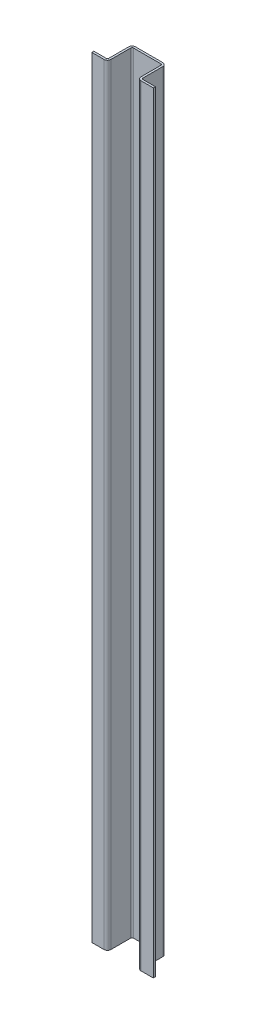
ISO-10303-21;
HEADER;
FILE_DESCRIPTION(('STEP AP214'),'2;1');
FILE_NAME('part.step','',(''),(''),'','','');
FILE_SCHEMA(('AUTOMOTIVE_DESIGN { 1 0 10303 214 1 1 1 1 }'));
ENDSEC;
DATA;
#1=APPLICATION_CONTEXT('core data for automotive mechanical design processes');
#2=APPLICATION_PROTOCOL_DEFINITION('international standard','automotive_design',2000,#1);
#3=PRODUCT_CONTEXT('',#1,'mechanical');
#4=PRODUCT('Part','Part','',(#3));
#5=PRODUCT_RELATED_PRODUCT_CATEGORY('part','',(#4));
#6=PRODUCT_DEFINITION_FORMATION('','',#4);
#7=PRODUCT_DEFINITION_CONTEXT('part definition',#1,'design');
#8=PRODUCT_DEFINITION('design','',#6,#7);
#9=PRODUCT_DEFINITION_SHAPE('','',#8);
#10=(LENGTH_UNIT() NAMED_UNIT(*) SI_UNIT(.MILLI.,.METRE.));
#11=(NAMED_UNIT(*) PLANE_ANGLE_UNIT() SI_UNIT($,.RADIAN.));
#12=(NAMED_UNIT(*) SI_UNIT($,.STERADIAN.) SOLID_ANGLE_UNIT());
#13=UNCERTAINTY_MEASURE_WITH_UNIT(LENGTH_MEASURE(1.E-05),#10,'distance_accuracy_value','');
#14=(GEOMETRIC_REPRESENTATION_CONTEXT(3) GLOBAL_UNCERTAINTY_ASSIGNED_CONTEXT((#13)) GLOBAL_UNIT_ASSIGNED_CONTEXT((#10,
#11,#12)) REPRESENTATION_CONTEXT('',''));
#15=CARTESIAN_POINT('',(0.,0.,0.));
#16=DIRECTION('',(0.,0.,1.));
#17=DIRECTION('',(1.,0.,0.));
#18=AXIS2_PLACEMENT_3D('',#15,#16,#17);
#19=CARTESIAN_POINT('',(-308.,-911.000000000001,-1.5));
#20=DIRECTION('',(1.,0.,0.));
#21=DIRECTION('',(0.,1.,0.));
#22=AXIS2_PLACEMENT_3D('',#19,#20,#21);
#23=PLANE('',#22);
#24=DIRECTION('',(0.,1.,0.));
#25=VECTOR('',#24,1.);
#26=CARTESIAN_POINT('',(-308.,-911.000000000001,-3.));
#27=LINE('',#26,#25);
#28=CARTESIAN_POINT('',(-308.,-347.000000000001,-3.));
#29=VERTEX_POINT('',#28);
#30=CARTESIAN_POINT('',(-308.,-911.000000000001,-3.));
#31=VERTEX_POINT('',#30);
#32=EDGE_CURVE('E176',#29,#31,#27,.F.);
#33=ORIENTED_EDGE('',*,*,#32,.T.);
#34=DIRECTION('',(0.,0.,1.));
#35=VECTOR('',#34,1.);
#36=CARTESIAN_POINT('',(-308.,-911.000000000001,-1.5));
#37=LINE('',#36,#35);
#38=CARTESIAN_POINT('',(-308.,-911.000000000001,-1.5));
#39=VERTEX_POINT('',#38);
#40=EDGE_CURVE('E137',#39,#31,#37,.F.);
#41=ORIENTED_EDGE('',*,*,#40,.F.);
#42=DIRECTION('',(0.,1.,0.));
#43=VECTOR('',#42,1.);
#44=CARTESIAN_POINT('',(-308.,-911.000000000001,-1.5));
#45=LINE('',#44,#43);
#46=CARTESIAN_POINT('',(-308.,-347.000000000001,-1.5));
#47=VERTEX_POINT('',#46);
#48=EDGE_CURVE('E179',#47,#39,#45,.F.);
#49=ORIENTED_EDGE('',*,*,#48,.F.);
#50=DIRECTION('',(0.,0.,1.));
#51=VECTOR('',#50,1.);
#52=CARTESIAN_POINT('',(-308.,-347.000000000002,-1.5));
#53=LINE('',#52,#51);
#54=EDGE_CURVE('E172',#29,#47,#53,.T.);
#55=ORIENTED_EDGE('',*,*,#54,.F.);
#56=EDGE_LOOP('',(#33,#41,#49,#55));
#57=FACE_BOUND('',#56,.T.);
#58=ADVANCED_FACE('F16',(#57),#23,.F.);
#59=CARTESIAN_POINT('',(-299.,-911.000000000001,-4.));
#60=DIRECTION('',(0.,1.,0.));
#61=DIRECTION('',(-1.,0.,0.));
#62=AXIS2_PLACEMENT_3D('',#59,#60,#61);
#63=CYLINDRICAL_SURFACE('',#62,1.);
#64=DIRECTION('',(0.,1.,0.));
#65=VECTOR('',#64,1.);
#66=CARTESIAN_POINT('',(-298.,-911.000000000001,-4.));
#67=LINE('',#66,#65);
#68=CARTESIAN_POINT('',(-298.,-347.000000000001,-4.));
#69=VERTEX_POINT('',#68);
#70=CARTESIAN_POINT('',(-298.,-911.000000000001,-4.));
#71=VERTEX_POINT('',#70);
#72=EDGE_CURVE('E283',#69,#71,#67,.F.);
#73=ORIENTED_EDGE('',*,*,#72,.T.);
#74=CARTESIAN_POINT('',(-299.,-911.000000000001,-4.));
#75=DIRECTION('',(0.,1.,0.));
#76=DIRECTION('',(-1.,0.,0.));
#77=AXIS2_PLACEMENT_3D('',#74,#75,#76);
#78=CIRCLE('',#77,1.);
#79=CARTESIAN_POINT('',(-299.,-911.000000000001,-3.));
#80=VERTEX_POINT('',#79);
#81=EDGE_CURVE('E19',#80,#71,#78,.T.);
#82=ORIENTED_EDGE('',*,*,#81,.F.);
#83=DIRECTION('',(0.,1.,0.));
#84=VECTOR('',#83,1.);
#85=CARTESIAN_POINT('',(-299.,-911.000000000001,-3.));
#86=LINE('',#85,#84);
#87=CARTESIAN_POINT('',(-299.,-347.000000000001,-3.));
#88=VERTEX_POINT('',#87);
#89=EDGE_CURVE('E187',#80,#88,#86,.T.);
#90=ORIENTED_EDGE('',*,*,#89,.T.);
#91=CARTESIAN_POINT('',(-299.,-347.000000000001,-4.));
#92=DIRECTION('',(0.,1.,0.));
#93=DIRECTION('',(-1.,0.,0.));
#94=AXIS2_PLACEMENT_3D('',#91,#92,#93);
#95=CIRCLE('',#94,1.);
#96=EDGE_CURVE('E191',#69,#88,#95,.F.);
#97=ORIENTED_EDGE('',*,*,#96,.F.);
#98=EDGE_LOOP('',(#73,#82,#90,#97));
#99=FACE_BOUND('',#98,.T.);
#100=ADVANCED_FACE('F338',(#99),#63,.F.);
#101=CARTESIAN_POINT('',(-272.,-911.000000000001,-4.));
#102=DIRECTION('',(0.,1.,0.));
#103=DIRECTION('',(-1.,0.,0.));
#104=AXIS2_PLACEMENT_3D('',#101,#102,#103);
#105=CYLINDRICAL_SURFACE('',#104,1.);
#106=DIRECTION('',(0.,1.,0.));
#107=VECTOR('',#106,1.);
#108=CARTESIAN_POINT('',(-272.,-911.000000000001,-3.));
#109=LINE('',#108,#107);
#110=CARTESIAN_POINT('',(-272.,-347.000000000001,-3.));
#111=VERTEX_POINT('',#110);
#112=CARTESIAN_POINT('',(-272.,-911.000000000001,-3.));
#113=VERTEX_POINT('',#112);
#114=EDGE_CURVE('E264',#111,#113,#109,.F.);
#115=ORIENTED_EDGE('',*,*,#114,.T.);
#116=CARTESIAN_POINT('',(-272.,-911.000000000001,-4.));
#117=DIRECTION('',(0.,1.,0.));
#118=DIRECTION('',(-1.,0.,0.));
#119=AXIS2_PLACEMENT_3D('',#116,#117,#118);
#120=CIRCLE('',#119,1.);
#121=CARTESIAN_POINT('',(-273.,-911.000000000001,-4.));
#122=VERTEX_POINT('',#121);
#123=EDGE_CURVE('E334',#122,#113,#120,.T.);
#124=ORIENTED_EDGE('',*,*,#123,.F.);
#125=DIRECTION('',(0.,-1.,0.));
#126=VECTOR('',#125,1.);
#127=CARTESIAN_POINT('',(-273.,-911.000000000001,-4.));
#128=LINE('',#127,#126);
#129=CARTESIAN_POINT('',(-273.,-347.000000000001,-4.));
#130=VERTEX_POINT('',#129);
#131=EDGE_CURVE('E267',#122,#130,#128,.F.);
#132=ORIENTED_EDGE('',*,*,#131,.T.);
#133=CARTESIAN_POINT('',(-272.,-347.000000000001,-4.));
#134=DIRECTION('',(0.,1.,0.));
#135=DIRECTION('',(-1.,0.,0.));
#136=AXIS2_PLACEMENT_3D('',#133,#134,#135);
#137=CIRCLE('',#136,1.);
#138=EDGE_CURVE('E302',#111,#130,#137,.F.);
#139=ORIENTED_EDGE('',*,*,#138,.F.);
#140=EDGE_LOOP('',(#115,#124,#132,#139));
#141=FACE_BOUND('',#140,.T.);
#142=ADVANCED_FACE('F364',(#141),#105,.F.);
#143=CARTESIAN_POINT('',(-263.,-911.000000000001,-3.));
#144=DIRECTION('',(-1.,0.,0.));
#145=DIRECTION('',(0.,-1.,0.));
#146=AXIS2_PLACEMENT_3D('',#143,#144,#145);
#147=PLANE('',#146);
#148=DIRECTION('',(0.,1.,0.));
#149=VECTOR('',#148,1.);
#150=CARTESIAN_POINT('',(-263.,-911.000000000001,-1.5));
#151=LINE('',#150,#149);
#152=CARTESIAN_POINT('',(-263.,-911.000000000001,-1.5));
#153=VERTEX_POINT('',#152);
#154=CARTESIAN_POINT('',(-263.,-347.000000000001,-1.5));
#155=VERTEX_POINT('',#154);
#156=EDGE_CURVE('E259',#153,#155,#151,.T.);
#157=ORIENTED_EDGE('',*,*,#156,.F.);
#158=DIRECTION('',(0.,0.,1.));
#159=VECTOR('',#158,1.);
#160=CARTESIAN_POINT('',(-263.,-911.000000000001,-3.));
#161=LINE('',#160,#159);
#162=CARTESIAN_POINT('',(-263.,-911.000000000001,-3.));
#163=VERTEX_POINT('',#162);
#164=EDGE_CURVE('E300',#163,#153,#161,.T.);
#165=ORIENTED_EDGE('',*,*,#164,.F.);
#166=DIRECTION('',(0.,1.,0.));
#167=VECTOR('',#166,1.);
#168=CARTESIAN_POINT('',(-263.,-911.000000000001,-3.));
#169=LINE('',#168,#167);
#170=CARTESIAN_POINT('',(-263.,-347.000000000001,-3.));
#171=VERTEX_POINT('',#170);
#172=EDGE_CURVE('E261',#163,#171,#169,.T.);
#173=ORIENTED_EDGE('',*,*,#172,.T.);
#174=DIRECTION('',(0.,0.,1.));
#175=VECTOR('',#174,1.);
#176=CARTESIAN_POINT('',(-263.,-347.000000000002,-3.));
#177=LINE('',#176,#175);
#178=EDGE_CURVE('E161',#155,#171,#177,.F.);
#179=ORIENTED_EDGE('',*,*,#178,.F.);
#180=EDGE_LOOP('',(#157,#165,#173,#179));
#181=FACE_BOUND('',#180,.T.);
#182=ADVANCED_FACE('F371',(#181),#147,.F.);
#183=CARTESIAN_POINT('',(-272.,-911.000000000001,-4.));
#184=DIRECTION('',(0.,1.,0.));
#185=DIRECTION('',(-1.,0.,0.));
#186=AXIS2_PLACEMENT_3D('',#183,#184,#185);
#187=CYLINDRICAL_SURFACE('',#186,2.5);
#188=CARTESIAN_POINT('',(-272.,-347.000000000001,-4.));
#189=DIRECTION('',(0.,1.,0.));
#190=DIRECTION('',(-1.,0.,0.));
#191=AXIS2_PLACEMENT_3D('',#188,#189,#190);
#192=CIRCLE('',#191,2.5);
#193=CARTESIAN_POINT('',(-272.,-347.000000000001,-1.5));
#194=VERTEX_POINT('',#193);
#195=CARTESIAN_POINT('',(-274.5,-347.000000000001,-4.));
#196=VERTEX_POINT('',#195);
#197=EDGE_CURVE('E209',#194,#196,#192,.F.);
#198=ORIENTED_EDGE('',*,*,#197,.T.);
#199=DIRECTION('',(0.,-1.,0.));
#200=VECTOR('',#199,1.);
#201=CARTESIAN_POINT('',(-274.5,-911.000000000001,-4.));
#202=LINE('',#201,#200);
#203=CARTESIAN_POINT('',(-274.5,-911.000000000001,-4.));
#204=VERTEX_POINT('',#203);
#205=EDGE_CURVE('E291',#204,#196,#202,.F.);
#206=ORIENTED_EDGE('',*,*,#205,.F.);
#207=CARTESIAN_POINT('',(-272.,-911.000000000001,-4.));
#208=DIRECTION('',(0.,1.,0.));
#209=DIRECTION('',(-1.,0.,0.));
#210=AXIS2_PLACEMENT_3D('',#207,#208,#209);
#211=CIRCLE('',#210,2.5);
#212=CARTESIAN_POINT('',(-272.,-911.000000000001,-1.5));
#213=VERTEX_POINT('',#212);
#214=EDGE_CURVE('E223',#213,#204,#211,.F.);
#215=ORIENTED_EDGE('',*,*,#214,.F.);
#216=DIRECTION('',(0.,1.,0.));
#217=VECTOR('',#216,1.);
#218=CARTESIAN_POINT('',(-272.,-911.000000000001,-1.5));
#219=LINE('',#218,#217);
#220=EDGE_CURVE('E257',#194,#213,#219,.F.);
#221=ORIENTED_EDGE('',*,*,#220,.F.);
#222=EDGE_LOOP('',(#198,#206,#215,#221));
#223=FACE_BOUND('',#222,.T.);
#224=ADVANCED_FACE('F380',(#223),#187,.T.);
#225=CARTESIAN_POINT('',(-274.5,-911.000000000001,-21.));
#226=DIRECTION('',(-1.,0.,0.));
#227=DIRECTION('',(0.,-1.,0.));
#228=AXIS2_PLACEMENT_3D('',#225,#226,#227);
#229=PLANE('',#228);
#230=DIRECTION('',(0.,0.,1.));
#231=VECTOR('',#230,1.);
#232=CARTESIAN_POINT('',(-274.5,-347.000000000001,-21.5));
#233=LINE('',#232,#231);
#234=CARTESIAN_POINT('',(-274.5,-347.000000000001,-18.5));
#235=VERTEX_POINT('',#234);
#236=EDGE_CURVE('E207',#196,#235,#233,.F.);
#237=ORIENTED_EDGE('',*,*,#236,.T.);
#238=DIRECTION('',(0.,1.,0.));
#239=VECTOR('',#238,1.);
#240=CARTESIAN_POINT('',(-274.5,-911.000000000001,-18.5));
#241=LINE('',#240,#239);
#242=CARTESIAN_POINT('',(-274.5,-911.000000000001,-18.5));
#243=VERTEX_POINT('',#242);
#244=EDGE_CURVE('E222',#235,#243,#241,.F.);
#245=ORIENTED_EDGE('',*,*,#244,.T.);
#246=DIRECTION('',(0.,0.,1.));
#247=VECTOR('',#246,1.);
#248=CARTESIAN_POINT('',(-274.5,-911.000000000001,-18.5));
#249=LINE('',#248,#247);
#250=EDGE_CURVE('E219',#204,#243,#249,.F.);
#251=ORIENTED_EDGE('',*,*,#250,.F.);
#252=ORIENTED_EDGE('',*,*,#205,.T.);
#253=EDGE_LOOP('',(#237,#245,#251,#252));
#254=FACE_BOUND('',#253,.T.);
#255=ADVANCED_FACE('F384',(#254),#229,.T.);
#256=CARTESIAN_POINT('',(-299.,-911.000000000001,-4.));
#257=DIRECTION('',(0.,1.,0.));
#258=DIRECTION('',(-1.,0.,0.));
#259=AXIS2_PLACEMENT_3D('',#256,#257,#258);
#260=CYLINDRICAL_SURFACE('',#259,2.5);
#261=CARTESIAN_POINT('',(-299.,-347.000000000001,-4.));
#262=DIRECTION('',(0.,1.,0.));
#263=DIRECTION('',(-1.,0.,0.));
#264=AXIS2_PLACEMENT_3D('',#261,#262,#263);
#265=CIRCLE('',#264,2.5);
#266=CARTESIAN_POINT('',(-296.5,-347.000000000001,-4.));
#267=VERTEX_POINT('',#266);
#268=CARTESIAN_POINT('',(-299.,-347.000000000001,-1.5));
#269=VERTEX_POINT('',#268);
#270=EDGE_CURVE('E197',#267,#269,#265,.F.);
#271=ORIENTED_EDGE('',*,*,#270,.T.);
#272=DIRECTION('',(0.,1.,0.));
#273=VECTOR('',#272,1.);
#274=CARTESIAN_POINT('',(-299.,-911.000000000001,-1.5));
#275=LINE('',#274,#273);
#276=CARTESIAN_POINT('',(-299.,-911.000000000001,-1.5));
#277=VERTEX_POINT('',#276);
#278=EDGE_CURVE('E288',#277,#269,#275,.T.);
#279=ORIENTED_EDGE('',*,*,#278,.F.);
#280=CARTESIAN_POINT('',(-299.,-911.000000000001,-4.));
#281=DIRECTION('',(0.,1.,0.));
#282=DIRECTION('',(-1.,0.,0.));
#283=AXIS2_PLACEMENT_3D('',#280,#281,#282);
#284=CIRCLE('',#283,2.5);
#285=CARTESIAN_POINT('',(-296.5,-911.000000000001,-4.));
#286=VERTEX_POINT('',#285);
#287=EDGE_CURVE('E250',#286,#277,#284,.F.);
#288=ORIENTED_EDGE('',*,*,#287,.F.);
#289=DIRECTION('',(0.,1.,0.));
#290=VECTOR('',#289,1.);
#291=CARTESIAN_POINT('',(-296.5,-911.000000000001,-4.));
#292=LINE('',#291,#290);
#293=EDGE_CURVE('E254',#267,#286,#292,.F.);
#294=ORIENTED_EDGE('',*,*,#293,.F.);
#295=EDGE_LOOP('',(#271,#279,#288,#294));
#296=FACE_BOUND('',#295,.T.);
#297=ADVANCED_FACE('F400',(#296),#260,.T.);
#298=CARTESIAN_POINT('',(-308.,-911.000000000001,-1.5));
#299=DIRECTION('',(0.,0.,1.));
#300=DIRECTION('',(1.,0.,0.));
#301=AXIS2_PLACEMENT_3D('',#298,#299,#300);
#302=PLANE('',#301);
#303=DIRECTION('',(1.,0.,0.));
#304=VECTOR('',#303,1.);
#305=CARTESIAN_POINT('',(-308.,-347.000000000001,-1.5));
#306=LINE('',#305,#304);
#307=EDGE_CURVE('E193',#269,#47,#306,.F.);
#308=ORIENTED_EDGE('',*,*,#307,.T.);
#309=ORIENTED_EDGE('',*,*,#48,.T.);
#310=DIRECTION('',(1.,0.,0.));
#311=VECTOR('',#310,1.);
#312=CARTESIAN_POINT('',(-274.5,-911.000000000001,-1.5));
#313=LINE('',#312,#311);
#314=EDGE_CURVE('E246',#277,#39,#313,.F.);
#315=ORIENTED_EDGE('',*,*,#314,.F.);
#316=ORIENTED_EDGE('',*,*,#278,.T.);
#317=EDGE_LOOP('',(#308,#309,#315,#316));
#318=FACE_BOUND('',#317,.T.);
#319=ADVANCED_FACE('F403',(#318),#302,.T.);
#320=CARTESIAN_POINT('',(-308.,-911.000000000001,-3.));
#321=DIRECTION('',(0.,0.,1.));
#322=DIRECTION('',(1.,0.,0.));
#323=AXIS2_PLACEMENT_3D('',#320,#321,#322);
#324=PLANE('',#323);
#325=ORIENTED_EDGE('',*,*,#89,.F.);
#326=DIRECTION('',(1.,0.,0.));
#327=VECTOR('',#326,1.);
#328=CARTESIAN_POINT('',(-274.5,-911.000000000001,-3.));
#329=LINE('',#328,#327);
#330=EDGE_CURVE('E186',#31,#80,#329,.T.);
#331=ORIENTED_EDGE('',*,*,#330,.F.);
#332=ORIENTED_EDGE('',*,*,#32,.F.);
#333=DIRECTION('',(1.,0.,0.));
#334=VECTOR('',#333,1.);
#335=CARTESIAN_POINT('',(-308.,-347.000000000001,-3.));
#336=LINE('',#335,#334);
#337=EDGE_CURVE('E185',#29,#88,#336,.T.);
#338=ORIENTED_EDGE('',*,*,#337,.T.);
#339=EDGE_LOOP('',(#325,#331,#332,#338));
#340=FACE_BOUND('',#339,.T.);
#341=ADVANCED_FACE('F184',(#340),#324,.F.);
#342=CARTESIAN_POINT('',(-298.,-911.000000000001,-3.));
#343=DIRECTION('',(1.,0.,0.));
#344=DIRECTION('',(0.,1.,0.));
#345=AXIS2_PLACEMENT_3D('',#342,#343,#344);
#346=PLANE('',#345);
#347=DIRECTION('',(0.,1.,0.));
#348=VECTOR('',#347,1.);
#349=CARTESIAN_POINT('',(-298.,-911.000000000001,-18.5));
#350=LINE('',#349,#348);
#351=CARTESIAN_POINT('',(-298.,-911.000000000001,-18.5));
#352=VERTEX_POINT('',#351);
#353=CARTESIAN_POINT('',(-298.,-347.000000000001,-18.5));
#354=VERTEX_POINT('',#353);
#355=EDGE_CURVE('E280',#352,#354,#350,.T.);
#356=ORIENTED_EDGE('',*,*,#355,.F.);
#357=DIRECTION('',(0.,0.,1.));
#358=VECTOR('',#357,1.);
#359=CARTESIAN_POINT('',(-298.,-911.000000000001,-18.5));
#360=LINE('',#359,#358);
#361=EDGE_CURVE('E242',#71,#352,#360,.F.);
#362=ORIENTED_EDGE('',*,*,#361,.F.);
#363=ORIENTED_EDGE('',*,*,#72,.F.);
#364=DIRECTION('',(0.,0.,1.));
#365=VECTOR('',#364,1.);
#366=CARTESIAN_POINT('',(-298.,-347.000000000001,-21.5));
#367=LINE('',#366,#365);
#368=EDGE_CURVE('E192',#69,#354,#367,.F.);
#369=ORIENTED_EDGE('',*,*,#368,.T.);
#370=EDGE_LOOP('',(#356,#362,#363,#369));
#371=FACE_BOUND('',#370,.T.);
#372=ADVANCED_FACE('F340',(#371),#346,.F.);
#373=CARTESIAN_POINT('',(-295.5,-911.000000000001,-18.5));
#374=DIRECTION('',(0.,1.,0.));
#375=DIRECTION('',(-1.,0.,0.));
#376=AXIS2_PLACEMENT_3D('',#373,#374,#375);
#377=CYLINDRICAL_SURFACE('',#376,2.5);
#378=ORIENTED_EDGE('',*,*,#355,.T.);
#379=CARTESIAN_POINT('',(-295.5,-347.000000000001,-18.5));
#380=DIRECTION('',(0.,1.,0.));
#381=DIRECTION('',(-1.,0.,0.));
#382=AXIS2_PLACEMENT_3D('',#379,#380,#381);
#383=CIRCLE('',#382,2.5);
#384=CARTESIAN_POINT('',(-295.5,-347.000000000001,-21.));
#385=VERTEX_POINT('',#384);
#386=EDGE_CURVE('E195',#354,#385,#383,.F.);
#387=ORIENTED_EDGE('',*,*,#386,.T.);
#388=DIRECTION('',(0.,1.,0.));
#389=VECTOR('',#388,1.);
#390=CARTESIAN_POINT('',(-295.5,-911.000000000001,-21.));
#391=LINE('',#390,#389);
#392=CARTESIAN_POINT('',(-295.5,-911.000000000001,-21.));
#393=VERTEX_POINT('',#392);
#394=EDGE_CURVE('E278',#385,#393,#391,.F.);
#395=ORIENTED_EDGE('',*,*,#394,.T.);
#396=CARTESIAN_POINT('',(-295.5,-911.000000000001,-18.5));
#397=DIRECTION('',(0.,1.,0.));
#398=DIRECTION('',(-1.,0.,0.));
#399=AXIS2_PLACEMENT_3D('',#396,#397,#398);
#400=CIRCLE('',#399,2.5);
#401=EDGE_CURVE('E241',#352,#393,#400,.F.);
#402=ORIENTED_EDGE('',*,*,#401,.F.);
#403=EDGE_LOOP('',(#378,#387,#395,#402));
#404=FACE_BOUND('',#403,.T.);
#405=ADVANCED_FACE('F344',(#404),#377,.T.);
#406=CARTESIAN_POINT('',(-298.,-911.000000000001,-21.));
#407=DIRECTION('',(0.,0.,1.));
#408=DIRECTION('',(1.,0.,0.));
#409=AXIS2_PLACEMENT_3D('',#406,#407,#408);
#410=PLANE('',#409);
#411=DIRECTION('',(0.,1.,0.));
#412=VECTOR('',#411,1.);
#413=CARTESIAN_POINT('',(-275.5,-911.000000000001,-21.));
#414=LINE('',#413,#412);
#415=CARTESIAN_POINT('',(-275.5,-911.000000000001,-21.));
#416=VERTEX_POINT('',#415);
#417=CARTESIAN_POINT('',(-275.5,-347.000000000001,-21.));
#418=VERTEX_POINT('',#417);
#419=EDGE_CURVE('E273',#416,#418,#414,.T.);
#420=ORIENTED_EDGE('',*,*,#419,.F.);
#421=DIRECTION('',(1.,0.,0.));
#422=VECTOR('',#421,1.);
#423=CARTESIAN_POINT('',(-274.5,-911.000000000001,-21.));
#424=LINE('',#423,#422);
#425=EDGE_CURVE('E238',#393,#416,#424,.T.);
#426=ORIENTED_EDGE('',*,*,#425,.F.);
#427=ORIENTED_EDGE('',*,*,#394,.F.);
#428=DIRECTION('',(1.,0.,0.));
#429=VECTOR('',#428,1.);
#430=CARTESIAN_POINT('',(-308.,-347.000000000001,-21.));
#431=LINE('',#430,#429);
#432=EDGE_CURVE('E319',#385,#418,#431,.T.);
#433=ORIENTED_EDGE('',*,*,#432,.T.);
#434=EDGE_LOOP('',(#420,#426,#427,#433));
#435=FACE_BOUND('',#434,.T.);
#436=ADVANCED_FACE('F349',(#435),#410,.F.);
#437=CARTESIAN_POINT('',(-275.5,-911.000000000001,-18.5));
#438=DIRECTION('',(0.,1.,0.));
#439=DIRECTION('',(-1.,0.,0.));
#440=AXIS2_PLACEMENT_3D('',#437,#438,#439);
#441=CYLINDRICAL_SURFACE('',#440,2.5);
#442=ORIENTED_EDGE('',*,*,#419,.T.);
#443=CARTESIAN_POINT('',(-275.5,-347.000000000001,-18.5));
#444=DIRECTION('',(0.,1.,0.));
#445=DIRECTION('',(-1.,0.,0.));
#446=AXIS2_PLACEMENT_3D('',#443,#444,#445);
#447=CIRCLE('',#446,2.5);
#448=CARTESIAN_POINT('',(-273.,-347.000000000001,-18.5));
#449=VERTEX_POINT('',#448);
#450=EDGE_CURVE('E316',#418,#449,#447,.F.);
#451=ORIENTED_EDGE('',*,*,#450,.T.);
#452=DIRECTION('',(0.,-1.,0.));
#453=VECTOR('',#452,1.);
#454=CARTESIAN_POINT('',(-273.,-911.000000000001,-18.5));
#455=LINE('',#454,#453);
#456=CARTESIAN_POINT('',(-273.,-911.000000000001,-18.5));
#457=VERTEX_POINT('',#456);
#458=EDGE_CURVE('E271',#449,#457,#455,.T.);
#459=ORIENTED_EDGE('',*,*,#458,.T.);
#460=CARTESIAN_POINT('',(-275.5,-911.000000000001,-18.5));
#461=DIRECTION('',(0.,1.,0.));
#462=DIRECTION('',(-1.,0.,0.));
#463=AXIS2_PLACEMENT_3D('',#460,#461,#462);
#464=CIRCLE('',#463,2.5);
#465=EDGE_CURVE('E237',#416,#457,#464,.F.);
#466=ORIENTED_EDGE('',*,*,#465,.F.);
#467=EDGE_LOOP('',(#442,#451,#459,#466));
#468=FACE_BOUND('',#467,.T.);
#469=ADVANCED_FACE('F353',(#468),#441,.T.);
#470=CARTESIAN_POINT('',(-273.,-911.000000000001,-21.));
#471=DIRECTION('',(-1.,0.,0.));
#472=DIRECTION('',(0.,-1.,0.));
#473=AXIS2_PLACEMENT_3D('',#470,#471,#472);
#474=PLANE('',#473);
#475=ORIENTED_EDGE('',*,*,#131,.F.);
#476=DIRECTION('',(0.,0.,1.));
#477=VECTOR('',#476,1.);
#478=CARTESIAN_POINT('',(-273.,-911.000000000001,-18.5));
#479=LINE('',#478,#477);
#480=EDGE_CURVE('E232',#457,#122,#479,.T.);
#481=ORIENTED_EDGE('',*,*,#480,.F.);
#482=ORIENTED_EDGE('',*,*,#458,.F.);
#483=DIRECTION('',(0.,0.,1.));
#484=VECTOR('',#483,1.);
#485=CARTESIAN_POINT('',(-273.,-347.000000000001,-21.5));
#486=LINE('',#485,#484);
#487=EDGE_CURVE('E318',#449,#130,#486,.T.);
#488=ORIENTED_EDGE('',*,*,#487,.T.);
#489=EDGE_LOOP('',(#475,#481,#482,#488));
#490=FACE_BOUND('',#489,.T.);
#491=ADVANCED_FACE('F360',(#490),#474,.F.);
#492=CARTESIAN_POINT('',(-273.,-911.000000000001,-3.));
#493=DIRECTION('',(0.,0.,1.));
#494=DIRECTION('',(1.,0.,0.));
#495=AXIS2_PLACEMENT_3D('',#492,#493,#494);
#496=PLANE('',#495);
#497=ORIENTED_EDGE('',*,*,#172,.F.);
#498=DIRECTION('',(1.,0.,0.));
#499=VECTOR('',#498,1.);
#500=CARTESIAN_POINT('',(-274.5,-911.000000000001,-3.));
#501=LINE('',#500,#499);
#502=EDGE_CURVE('E227',#113,#163,#501,.T.);
#503=ORIENTED_EDGE('',*,*,#502,.F.);
#504=ORIENTED_EDGE('',*,*,#114,.F.);
#505=DIRECTION('',(1.,0.,0.));
#506=VECTOR('',#505,1.);
#507=CARTESIAN_POINT('',(-308.,-347.000000000001,-3.));
#508=LINE('',#507,#506);
#509=EDGE_CURVE('E370',#111,#171,#508,.T.);
#510=ORIENTED_EDGE('',*,*,#509,.T.);
#511=EDGE_LOOP('',(#497,#503,#504,#510));
#512=FACE_BOUND('',#511,.T.);
#513=ADVANCED_FACE('F369',(#512),#496,.F.);
#514=CARTESIAN_POINT('',(-273.,-911.000000000001,-1.5));
#515=DIRECTION('',(0.,0.,1.));
#516=DIRECTION('',(1.,0.,0.));
#517=AXIS2_PLACEMENT_3D('',#514,#515,#516);
#518=PLANE('',#517);
#519=DIRECTION('',(1.,0.,0.));
#520=VECTOR('',#519,1.);
#521=CARTESIAN_POINT('',(-308.,-347.000000000001,-1.5));
#522=LINE('',#521,#520);
#523=EDGE_CURVE('E315',#155,#194,#522,.F.);
#524=ORIENTED_EDGE('',*,*,#523,.T.);
#525=ORIENTED_EDGE('',*,*,#220,.T.);
#526=DIRECTION('',(1.,0.,0.));
#527=VECTOR('',#526,1.);
#528=CARTESIAN_POINT('',(-274.5,-911.000000000001,-1.5));
#529=LINE('',#528,#527);
#530=EDGE_CURVE('E224',#153,#213,#529,.F.);
#531=ORIENTED_EDGE('',*,*,#530,.F.);
#532=ORIENTED_EDGE('',*,*,#156,.T.);
#533=EDGE_LOOP('',(#524,#525,#531,#532));
#534=FACE_BOUND('',#533,.T.);
#535=ADVANCED_FACE('F376',(#534),#518,.T.);
#536=CARTESIAN_POINT('',(-296.5,-911.000000000001,-3.));
#537=DIRECTION('',(1.,0.,0.));
#538=DIRECTION('',(0.,1.,0.));
#539=AXIS2_PLACEMENT_3D('',#536,#537,#538);
#540=PLANE('',#539);
#541=DIRECTION('',(0.,0.,1.));
#542=VECTOR('',#541,1.);
#543=CARTESIAN_POINT('',(-296.5,-347.000000000001,-21.5));
#544=LINE('',#543,#542);
#545=CARTESIAN_POINT('',(-296.5,-347.000000000001,-18.5));
#546=VERTEX_POINT('',#545);
#547=EDGE_CURVE('E154',#546,#267,#544,.T.);
#548=ORIENTED_EDGE('',*,*,#547,.T.);
#549=ORIENTED_EDGE('',*,*,#293,.T.);
#550=DIRECTION('',(0.,0.,1.));
#551=VECTOR('',#550,1.);
#552=CARTESIAN_POINT('',(-296.5,-911.000000000001,-18.5));
#553=LINE('',#552,#551);
#554=CARTESIAN_POINT('',(-296.5,-911.000000000001,-18.5));
#555=VERTEX_POINT('',#554);
#556=EDGE_CURVE('E149',#555,#286,#553,.T.);
#557=ORIENTED_EDGE('',*,*,#556,.F.);
#558=DIRECTION('',(0.,1.,0.));
#559=VECTOR('',#558,1.);
#560=CARTESIAN_POINT('',(-296.5,-911.000000000001,-18.5));
#561=LINE('',#560,#559);
#562=EDGE_CURVE('E218',#555,#546,#561,.T.);
#563=ORIENTED_EDGE('',*,*,#562,.T.);
#564=EDGE_LOOP('',(#548,#549,#557,#563));
#565=FACE_BOUND('',#564,.T.);
#566=ADVANCED_FACE('F397',(#565),#540,.T.);
#567=CARTESIAN_POINT('',(-274.5,-911.000000000001,-18.5));
#568=DIRECTION('',(0.,-1.,0.));
#569=DIRECTION('',(1.,0.,0.));
#570=AXIS2_PLACEMENT_3D('',#567,#568,#569);
#571=PLANE('',#570);
#572=ORIENTED_EDGE('',*,*,#250,.T.);
#573=CARTESIAN_POINT('',(-275.5,-911.000000000001,-18.5));
#574=DIRECTION('',(0.,1.,0.));
#575=DIRECTION('',(-1.,0.,0.));
#576=AXIS2_PLACEMENT_3D('',#573,#574,#575);
#577=CIRCLE('',#576,1.);
#578=CARTESIAN_POINT('',(-275.5,-911.000000000001,-19.5));
#579=VERTEX_POINT('',#578);
#580=EDGE_CURVE('E297',#243,#579,#577,.T.);
#581=ORIENTED_EDGE('',*,*,#580,.T.);
#582=DIRECTION('',(1.,0.,0.));
#583=VECTOR('',#582,1.);
#584=CARTESIAN_POINT('',(-298.,-911.000000000001,-19.5));
#585=LINE('',#584,#583);
#586=CARTESIAN_POINT('',(-295.5,-911.000000000001,-19.5));
#587=VERTEX_POINT('',#586);
#588=EDGE_CURVE('E213',#587,#579,#585,.T.);
#589=ORIENTED_EDGE('',*,*,#588,.F.);
#590=CARTESIAN_POINT('',(-295.5,-911.000000000001,-18.5));
#591=DIRECTION('',(0.,1.,0.));
#592=DIRECTION('',(-1.,0.,0.));
#593=AXIS2_PLACEMENT_3D('',#590,#591,#592);
#594=CIRCLE('',#593,1.);
#595=EDGE_CURVE('E256',#587,#555,#594,.T.);
#596=ORIENTED_EDGE('',*,*,#595,.T.);
#597=ORIENTED_EDGE('',*,*,#556,.T.);
#598=ORIENTED_EDGE('',*,*,#287,.T.);
#599=ORIENTED_EDGE('',*,*,#314,.T.);
#600=ORIENTED_EDGE('',*,*,#40,.T.);
#601=ORIENTED_EDGE('',*,*,#330,.T.);
#602=ORIENTED_EDGE('',*,*,#81,.T.);
#603=ORIENTED_EDGE('',*,*,#361,.T.);
#604=ORIENTED_EDGE('',*,*,#401,.T.);
#605=ORIENTED_EDGE('',*,*,#425,.T.);
#606=ORIENTED_EDGE('',*,*,#465,.T.);
#607=ORIENTED_EDGE('',*,*,#480,.T.);
#608=ORIENTED_EDGE('',*,*,#123,.T.);
#609=ORIENTED_EDGE('',*,*,#502,.T.);
#610=ORIENTED_EDGE('',*,*,#164,.T.);
#611=ORIENTED_EDGE('',*,*,#530,.T.);
#612=ORIENTED_EDGE('',*,*,#214,.T.);
#613=EDGE_LOOP('',(#572,#581,#589,#596,#597,#598,#599,#600,#601,#602,#603,#604,#605,#606,#607,
#608,#609,#610,#611,#612));
#614=FACE_BOUND('',#613,.T.);
#615=ADVANCED_FACE('F335',(#614),#571,.T.);
#616=CARTESIAN_POINT('',(-275.5,-911.000000000001,-18.5));
#617=DIRECTION('',(0.,1.,0.));
#618=DIRECTION('',(-1.,0.,0.));
#619=AXIS2_PLACEMENT_3D('',#616,#617,#618);
#620=CYLINDRICAL_SURFACE('',#619,1.);
#621=ORIENTED_EDGE('',*,*,#580,.F.);
#622=ORIENTED_EDGE('',*,*,#244,.F.);
#623=CARTESIAN_POINT('',(-275.5,-347.000000000001,-18.5));
#624=DIRECTION('',(0.,1.,0.));
#625=DIRECTION('',(-1.,0.,0.));
#626=AXIS2_PLACEMENT_3D('',#623,#624,#625);
#627=CIRCLE('',#626,1.);
#628=CARTESIAN_POINT('',(-275.5,-347.000000000001,-19.5));
#629=VERTEX_POINT('',#628);
#630=EDGE_CURVE('E206',#235,#629,#627,.T.);
#631=ORIENTED_EDGE('',*,*,#630,.T.);
#632=DIRECTION('',(0.,1.,0.));
#633=VECTOR('',#632,1.);
#634=CARTESIAN_POINT('',(-275.5,-911.000000000001,-19.5));
#635=LINE('',#634,#633);
#636=EDGE_CURVE('E210',#579,#629,#635,.T.);
#637=ORIENTED_EDGE('',*,*,#636,.F.);
#638=EDGE_LOOP('',(#621,#622,#631,#637));
#639=FACE_BOUND('',#638,.T.);
#640=ADVANCED_FACE('F389',(#639),#620,.F.);
#641=CARTESIAN_POINT('',(-308.,-347.000000000001,-21.5));
#642=DIRECTION('',(0.,-1.,0.));
#643=DIRECTION('',(1.,0.,0.));
#644=AXIS2_PLACEMENT_3D('',#641,#642,#643);
#645=PLANE('',#644);
#646=ORIENTED_EDGE('',*,*,#178,.T.);
#647=ORIENTED_EDGE('',*,*,#509,.F.);
#648=ORIENTED_EDGE('',*,*,#138,.T.);
#649=ORIENTED_EDGE('',*,*,#487,.F.);
#650=ORIENTED_EDGE('',*,*,#450,.F.);
#651=ORIENTED_EDGE('',*,*,#432,.F.);
#652=ORIENTED_EDGE('',*,*,#386,.F.);
#653=ORIENTED_EDGE('',*,*,#368,.F.);
#654=ORIENTED_EDGE('',*,*,#96,.T.);
#655=ORIENTED_EDGE('',*,*,#337,.F.);
#656=ORIENTED_EDGE('',*,*,#54,.T.);
#657=ORIENTED_EDGE('',*,*,#307,.F.);
#658=ORIENTED_EDGE('',*,*,#270,.F.);
#659=ORIENTED_EDGE('',*,*,#547,.F.);
#660=CARTESIAN_POINT('',(-295.5,-347.000000000001,-18.5));
#661=DIRECTION('',(0.,1.,0.));
#662=DIRECTION('',(-1.,0.,0.));
#663=AXIS2_PLACEMENT_3D('',#660,#661,#662);
#664=CIRCLE('',#663,1.);
#665=CARTESIAN_POINT('',(-295.5,-347.000000000001,-19.5));
#666=VERTEX_POINT('',#665);
#667=EDGE_CURVE('E34',#546,#666,#664,.F.);
#668=ORIENTED_EDGE('',*,*,#667,.T.);
#669=DIRECTION('',(1.,0.,0.));
#670=VECTOR('',#669,1.);
#671=CARTESIAN_POINT('',(-298.,-347.000000000001,-19.5));
#672=LINE('',#671,#670);
#673=EDGE_CURVE('E25',#629,#666,#672,.F.);
#674=ORIENTED_EDGE('',*,*,#673,.F.);
#675=ORIENTED_EDGE('',*,*,#630,.F.);
#676=ORIENTED_EDGE('',*,*,#236,.F.);
#677=ORIENTED_EDGE('',*,*,#197,.F.);
#678=ORIENTED_EDGE('',*,*,#523,.F.);
#679=EDGE_LOOP('',(#646,#647,#648,#649,#650,#651,#652,#653,#654,#655,#656,#657,#658,#659,#668,
#674,#675,#676,#677,#678));
#680=FACE_BOUND('',#679,.T.);
#681=ADVANCED_FACE('F189',(#680),#645,.F.);
#682=CARTESIAN_POINT('',(-295.5,-911.000000000001,-18.5));
#683=DIRECTION('',(0.,1.,0.));
#684=DIRECTION('',(-1.,0.,0.));
#685=AXIS2_PLACEMENT_3D('',#682,#683,#684);
#686=CYLINDRICAL_SURFACE('',#685,1.);
#687=ORIENTED_EDGE('',*,*,#595,.F.);
#688=DIRECTION('',(0.,1.,0.));
#689=VECTOR('',#688,1.);
#690=CARTESIAN_POINT('',(-295.5,-911.000000000001,-19.5));
#691=LINE('',#690,#689);
#692=EDGE_CURVE('E11',#666,#587,#691,.F.);
#693=ORIENTED_EDGE('',*,*,#692,.F.);
#694=ORIENTED_EDGE('',*,*,#667,.F.);
#695=ORIENTED_EDGE('',*,*,#562,.F.);
#696=EDGE_LOOP('',(#687,#693,#694,#695));
#697=FACE_BOUND('',#696,.T.);
#698=ADVANCED_FACE('F396',(#697),#686,.F.);
#699=CARTESIAN_POINT('',(-298.,-911.000000000001,-19.5));
#700=DIRECTION('',(0.,0.,1.));
#701=DIRECTION('',(1.,0.,0.));
#702=AXIS2_PLACEMENT_3D('',#699,#700,#701);
#703=PLANE('',#702);
#704=ORIENTED_EDGE('',*,*,#673,.T.);
#705=ORIENTED_EDGE('',*,*,#692,.T.);
#706=ORIENTED_EDGE('',*,*,#588,.T.);
#707=ORIENTED_EDGE('',*,*,#636,.T.);
#708=EDGE_LOOP('',(#704,#705,#706,#707));
#709=FACE_BOUND('',#708,.T.);
#710=ADVANCED_FACE('F392',(#709),#703,.T.);
#711=CLOSED_SHELL('',(#58,#100,#142,#182,#224,#255,#297,#319,#341,#372,#405,#436,#469,#491,#513,
#535,#566,#615,#640,#681,#698,#710));
#712=MANIFOLD_SOLID_BREP('B1',#711);
#713=ADVANCED_BREP_SHAPE_REPRESENTATION('',(#18,#712),#14);
#714=SHAPE_DEFINITION_REPRESENTATION(#9,#713);
ENDSEC;
END-ISO-10303-21;
